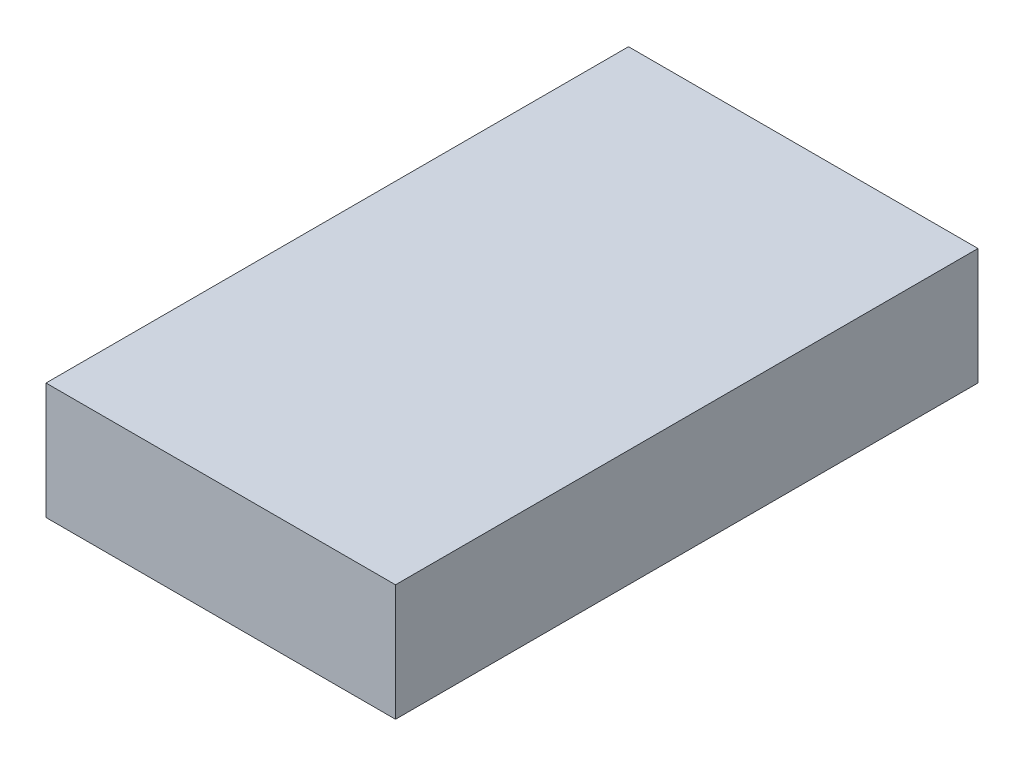
ISO-10303-21;
HEADER;
FILE_DESCRIPTION(('STEP AP214'),'2;1');
FILE_NAME('part.step','',(''),(''),'','','');
FILE_SCHEMA(('AUTOMOTIVE_DESIGN { 1 0 10303 214 1 1 1 1 }'));
ENDSEC;
DATA;
#1=APPLICATION_CONTEXT('core data for automotive mechanical design processes');
#2=APPLICATION_PROTOCOL_DEFINITION('international standard','automotive_design',2000,#1);
#3=PRODUCT_CONTEXT('',#1,'mechanical');
#4=PRODUCT('Part','Part','',(#3));
#5=PRODUCT_RELATED_PRODUCT_CATEGORY('part','',(#4));
#6=PRODUCT_DEFINITION_FORMATION('','',#4);
#7=PRODUCT_DEFINITION_CONTEXT('part definition',#1,'design');
#8=PRODUCT_DEFINITION('design','',#6,#7);
#9=PRODUCT_DEFINITION_SHAPE('','',#8);
#10=(LENGTH_UNIT() NAMED_UNIT(*) SI_UNIT(.MILLI.,.METRE.));
#11=(NAMED_UNIT(*) PLANE_ANGLE_UNIT() SI_UNIT($,.RADIAN.));
#12=(NAMED_UNIT(*) SI_UNIT($,.STERADIAN.) SOLID_ANGLE_UNIT());
#13=UNCERTAINTY_MEASURE_WITH_UNIT(LENGTH_MEASURE(1.E-05),#10,'distance_accuracy_value','');
#14=(GEOMETRIC_REPRESENTATION_CONTEXT(3) GLOBAL_UNCERTAINTY_ASSIGNED_CONTEXT((#13)) GLOBAL_UNIT_ASSIGNED_CONTEXT((#10,
#11,#12)) REPRESENTATION_CONTEXT('',''));
#15=CARTESIAN_POINT('',(0.,0.,0.));
#16=DIRECTION('',(0.,0.,1.));
#17=DIRECTION('',(1.,0.,0.));
#18=AXIS2_PLACEMENT_3D('',#15,#16,#17);
#19=CARTESIAN_POINT('',(-93.6521739130434,100.434782608696,300.));
#20=DIRECTION('',(1.,0.,0.));
#21=DIRECTION('',(0.,1.,0.));
#22=AXIS2_PLACEMENT_3D('',#19,#20,#21);
#23=PLANE('',#22);
#24=DIRECTION('',(0.,-1.,0.));
#25=VECTOR('',#24,1.);
#26=CARTESIAN_POINT('',(-93.6521739130434,100.434782608696,0.));
#27=LINE('',#26,#25);
#28=CARTESIAN_POINT('',(-93.6521739130434,100.434782608696,0.));
#29=VERTEX_POINT('',#28);
#30=CARTESIAN_POINT('',(-93.6521739130434,40.4347826086956,0.));
#31=VERTEX_POINT('',#30);
#32=EDGE_CURVE('E97',#29,#31,#27,.T.);
#33=ORIENTED_EDGE('',*,*,#32,.T.);
#34=DIRECTION('',(0.,0.,-1.));
#35=VECTOR('',#34,1.);
#36=CARTESIAN_POINT('',(-93.6521739130434,40.4347826086956,300.));
#37=LINE('',#36,#35);
#38=CARTESIAN_POINT('',(-93.6521739130434,40.4347826086956,300.));
#39=VERTEX_POINT('',#38);
#40=EDGE_CURVE('E11',#39,#31,#37,.T.);
#41=ORIENTED_EDGE('',*,*,#40,.F.);
#42=DIRECTION('',(0.,-1.,0.));
#43=VECTOR('',#42,1.);
#44=CARTESIAN_POINT('',(-93.6521739130434,100.434782608696,300.));
#45=LINE('',#44,#43);
#46=CARTESIAN_POINT('',(-93.6521739130434,100.434782608696,300.));
#47=VERTEX_POINT('',#46);
#48=EDGE_CURVE('E85',#47,#39,#45,.T.);
#49=ORIENTED_EDGE('',*,*,#48,.F.);
#50=DIRECTION('',(0.,0.,-1.));
#51=VECTOR('',#50,1.);
#52=CARTESIAN_POINT('',(-93.6521739130434,100.434782608696,300.));
#53=LINE('',#52,#51);
#54=EDGE_CURVE('E93',#47,#29,#53,.T.);
#55=ORIENTED_EDGE('',*,*,#54,.T.);
#56=EDGE_LOOP('',(#33,#41,#49,#55));
#57=FACE_BOUND('',#56,.T.);
#58=ADVANCED_FACE('F34',(#57),#23,.F.);
#59=CARTESIAN_POINT('',(-93.6521739130434,40.4347826086956,300.));
#60=DIRECTION('',(0.,1.,0.));
#61=DIRECTION('',(0.,0.,1.));
#62=AXIS2_PLACEMENT_3D('',#59,#60,#61);
#63=PLANE('',#62);
#64=DIRECTION('',(1.,0.,0.));
#65=VECTOR('',#64,1.);
#66=CARTESIAN_POINT('',(-93.6521739130434,40.4347826086956,0.));
#67=LINE('',#66,#65);
#68=CARTESIAN_POINT('',(86.3478260869566,40.4347826086956,0.));
#69=VERTEX_POINT('',#68);
#70=EDGE_CURVE('E89',#31,#69,#67,.T.);
#71=ORIENTED_EDGE('',*,*,#70,.T.);
#72=DIRECTION('',(0.,0.,-1.));
#73=VECTOR('',#72,1.);
#74=CARTESIAN_POINT('',(86.3478260869566,40.4347826086956,300.));
#75=LINE('',#74,#73);
#76=CARTESIAN_POINT('',(86.3478260869566,40.4347826086956,300.));
#77=VERTEX_POINT('',#76);
#78=EDGE_CURVE('E42',#77,#69,#75,.T.);
#79=ORIENTED_EDGE('',*,*,#78,.F.);
#80=DIRECTION('',(1.,0.,0.));
#81=VECTOR('',#80,1.);
#82=CARTESIAN_POINT('',(-93.6521739130434,40.4347826086956,300.));
#83=LINE('',#82,#81);
#84=EDGE_CURVE('E80',#39,#77,#83,.T.);
#85=ORIENTED_EDGE('',*,*,#84,.F.);
#86=ORIENTED_EDGE('',*,*,#40,.T.);
#87=EDGE_LOOP('',(#71,#79,#85,#86));
#88=FACE_BOUND('',#87,.T.);
#89=ADVANCED_FACE('F88',(#88),#63,.F.);
#90=CARTESIAN_POINT('',(86.3478260869566,100.434782608696,300.));
#91=DIRECTION('',(-1.,0.,0.));
#92=DIRECTION('',(0.,0.,1.));
#93=AXIS2_PLACEMENT_3D('',#90,#91,#92);
#94=PLANE('',#93);
#95=DIRECTION('',(0.,1.,0.));
#96=VECTOR('',#95,1.);
#97=CARTESIAN_POINT('',(86.3478260869566,100.434782608696,0.));
#98=LINE('',#97,#96);
#99=CARTESIAN_POINT('',(86.3478260869566,100.434782608696,0.));
#100=VERTEX_POINT('',#99);
#101=EDGE_CURVE('E67',#69,#100,#98,.T.);
#102=ORIENTED_EDGE('',*,*,#101,.T.);
#103=DIRECTION('',(0.,0.,-1.));
#104=VECTOR('',#103,1.);
#105=CARTESIAN_POINT('',(86.3478260869566,100.434782608696,300.));
#106=LINE('',#105,#104);
#107=CARTESIAN_POINT('',(86.3478260869566,100.434782608696,300.));
#108=VERTEX_POINT('',#107);
#109=EDGE_CURVE('E90',#108,#100,#106,.T.);
#110=ORIENTED_EDGE('',*,*,#109,.F.);
#111=DIRECTION('',(0.,1.,0.));
#112=VECTOR('',#111,1.);
#113=CARTESIAN_POINT('',(86.3478260869566,100.434782608696,300.));
#114=LINE('',#113,#112);
#115=EDGE_CURVE('E83',#77,#108,#114,.T.);
#116=ORIENTED_EDGE('',*,*,#115,.F.);
#117=ORIENTED_EDGE('',*,*,#78,.T.);
#118=EDGE_LOOP('',(#102,#110,#116,#117));
#119=FACE_BOUND('',#118,.T.);
#120=ADVANCED_FACE('F91',(#119),#94,.F.);
#121=CARTESIAN_POINT('',(-93.6521739130434,100.434782608696,300.));
#122=DIRECTION('',(0.,-1.,0.));
#123=DIRECTION('',(0.,0.,-1.));
#124=AXIS2_PLACEMENT_3D('',#121,#122,#123);
#125=PLANE('',#124);
#126=DIRECTION('',(-1.,0.,0.));
#127=VECTOR('',#126,1.);
#128=CARTESIAN_POINT('',(-93.6521739130434,100.434782608696,0.));
#129=LINE('',#128,#127);
#130=EDGE_CURVE('E73',#100,#29,#129,.T.);
#131=ORIENTED_EDGE('',*,*,#130,.T.);
#132=ORIENTED_EDGE('',*,*,#54,.F.);
#133=DIRECTION('',(-1.,0.,0.));
#134=VECTOR('',#133,1.);
#135=CARTESIAN_POINT('',(-93.6521739130434,100.434782608696,300.));
#136=LINE('',#135,#134);
#137=EDGE_CURVE('E50',#108,#47,#136,.T.);
#138=ORIENTED_EDGE('',*,*,#137,.F.);
#139=ORIENTED_EDGE('',*,*,#109,.T.);
#140=EDGE_LOOP('',(#131,#132,#138,#139));
#141=FACE_BOUND('',#140,.T.);
#142=ADVANCED_FACE('F104',(#141),#125,.F.);
#143=CARTESIAN_POINT('',(0.,0.,300.));
#144=DIRECTION('',(0.,0.,1.));
#145=DIRECTION('',(1.,0.,0.));
#146=AXIS2_PLACEMENT_3D('',#143,#144,#145);
#147=PLANE('',#146);
#148=ORIENTED_EDGE('',*,*,#48,.T.);
#149=ORIENTED_EDGE('',*,*,#84,.T.);
#150=ORIENTED_EDGE('',*,*,#115,.T.);
#151=ORIENTED_EDGE('',*,*,#137,.T.);
#152=EDGE_LOOP('',(#148,#149,#150,#151));
#153=FACE_BOUND('',#152,.T.);
#154=ADVANCED_FACE('F81',(#153),#147,.T.);
#155=CARTESIAN_POINT('',(0.,0.,0.));
#156=DIRECTION('',(0.,0.,1.));
#157=DIRECTION('',(1.,0.,0.));
#158=AXIS2_PLACEMENT_3D('',#155,#156,#157);
#159=PLANE('',#158);
#160=ORIENTED_EDGE('',*,*,#32,.F.);
#161=ORIENTED_EDGE('',*,*,#130,.F.);
#162=ORIENTED_EDGE('',*,*,#101,.F.);
#163=ORIENTED_EDGE('',*,*,#70,.F.);
#164=EDGE_LOOP('',(#160,#161,#162,#163));
#165=FACE_BOUND('',#164,.T.);
#166=ADVANCED_FACE('F107',(#165),#159,.F.);
#167=CLOSED_SHELL('',(#58,#89,#120,#142,#154,#166));
#168=MANIFOLD_SOLID_BREP('B2',#167);
#169=ADVANCED_BREP_SHAPE_REPRESENTATION('',(#18,#168),#14);
#170=SHAPE_DEFINITION_REPRESENTATION(#9,#169);
ENDSEC;
END-ISO-10303-21;
